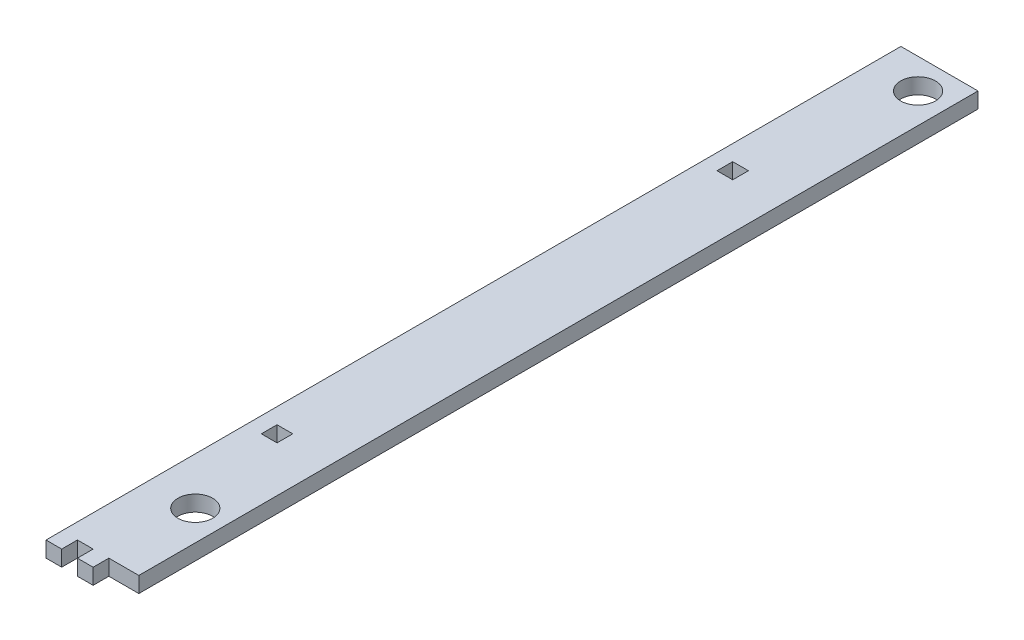
ISO-10303-21;
HEADER;
FILE_DESCRIPTION(('STEP AP214'),'2;1');
FILE_NAME('part.step','',(''),(''),'','','');
FILE_SCHEMA(('AUTOMOTIVE_DESIGN { 1 0 10303 214 1 1 1 1 }'));
ENDSEC;
DATA;
#1=APPLICATION_CONTEXT('core data for automotive mechanical design processes');
#2=APPLICATION_PROTOCOL_DEFINITION('international standard','automotive_design',2000,#1);
#3=PRODUCT_CONTEXT('',#1,'mechanical');
#4=PRODUCT('Part','Part','',(#3));
#5=PRODUCT_RELATED_PRODUCT_CATEGORY('part','',(#4));
#6=PRODUCT_DEFINITION_FORMATION('','',#4);
#7=PRODUCT_DEFINITION_CONTEXT('part definition',#1,'design');
#8=PRODUCT_DEFINITION('design','',#6,#7);
#9=PRODUCT_DEFINITION_SHAPE('','',#8);
#10=(LENGTH_UNIT() NAMED_UNIT(*) SI_UNIT(.MILLI.,.METRE.));
#11=(NAMED_UNIT(*) PLANE_ANGLE_UNIT() SI_UNIT($,.RADIAN.));
#12=(NAMED_UNIT(*) SI_UNIT($,.STERADIAN.) SOLID_ANGLE_UNIT());
#13=UNCERTAINTY_MEASURE_WITH_UNIT(LENGTH_MEASURE(1.E-05),#10,'distance_accuracy_value','');
#14=(GEOMETRIC_REPRESENTATION_CONTEXT(3) GLOBAL_UNCERTAINTY_ASSIGNED_CONTEXT((#13)) GLOBAL_UNIT_ASSIGNED_CONTEXT((#10,
#11,#12)) REPRESENTATION_CONTEXT('',''));
#15=CARTESIAN_POINT('',(0.,0.,0.));
#16=DIRECTION('',(0.,0.,1.));
#17=DIRECTION('',(1.,0.,0.));
#18=AXIS2_PLACEMENT_3D('',#15,#16,#17);
#19=CARTESIAN_POINT('',(0.,6.35,0.));
#20=DIRECTION('',(0.,1.,0.));
#21=DIRECTION('',(0.,0.,1.));
#22=AXIS2_PLACEMENT_3D('',#19,#20,#21);
#23=PLANE('',#22);
#24=DIRECTION('',(1.,0.,0.));
#25=VECTOR('',#24,1.);
#26=CARTESIAN_POINT('',(6.34999999999996,6.35,-88.9));
#27=LINE('',#26,#25);
#28=CARTESIAN_POINT('',(6.34999999999996,6.35,-88.9));
#29=VERTEX_POINT('',#28);
#30=CARTESIAN_POINT('',(12.7,6.35,-88.9));
#31=VERTEX_POINT('',#30);
#32=EDGE_CURVE('E196',#29,#31,#27,.T.);
#33=ORIENTED_EDGE('',*,*,#32,.F.);
#34=DIRECTION('',(0.,0.,1.));
#35=VECTOR('',#34,1.);
#36=CARTESIAN_POINT('',(6.34999999999996,6.35,-95.25));
#37=LINE('',#36,#35);
#38=CARTESIAN_POINT('',(6.34999999999996,6.35,-95.25));
#39=VERTEX_POINT('',#38);
#40=EDGE_CURVE('E194',#39,#29,#37,.T.);
#41=ORIENTED_EDGE('',*,*,#40,.F.);
#42=DIRECTION('',(-1.,0.,0.));
#43=VECTOR('',#42,1.);
#44=CARTESIAN_POINT('',(6.34999999999996,6.35,-95.25));
#45=LINE('',#44,#43);
#46=CARTESIAN_POINT('',(12.7,6.35,-95.25));
#47=VERTEX_POINT('',#46);
#48=EDGE_CURVE('E202',#47,#39,#45,.T.);
#49=ORIENTED_EDGE('',*,*,#48,.F.);
#50=DIRECTION('',(0.,0.,-1.));
#51=VECTOR('',#50,1.);
#52=CARTESIAN_POINT('',(12.7,6.35,-95.25));
#53=LINE('',#52,#51);
#54=EDGE_CURVE('E199',#31,#47,#53,.T.);
#55=ORIENTED_EDGE('',*,*,#54,.F.);
#56=EDGE_LOOP('',(#33,#41,#49,#55));
#57=FACE_BOUND('',#56,.T.);
#58=CARTESIAN_POINT('',(19.05,6.35,134.642564030267));
#59=DIRECTION('',(0.,1.,0.));
#60=DIRECTION('',(0.,0.,-1.));
#61=AXIS2_PLACEMENT_3D('',#58,#59,#60);
#62=CIRCLE('',#61,7.03012806053458);
#63=CARTESIAN_POINT('',(19.05,6.35,127.612435969733));
#64=VERTEX_POINT('',#63);
#65=EDGE_CURVE('E231',#64,#64,#62,.T.);
#66=ORIENTED_EDGE('',*,*,#65,.F.);
#67=EDGE_LOOP('',(#66));
#68=FACE_BOUND('',#67,.T.);
#69=DIRECTION('',(-1.,0.,0.));
#70=VECTOR('',#69,1.);
#71=CARTESIAN_POINT('',(0.,6.35,-169.567564030267));
#72=LINE('',#71,#70);
#73=CARTESIAN_POINT('',(31.1601280605345,6.35,-169.567564030267));
#74=VERTEX_POINT('',#73);
#75=CARTESIAN_POINT('',(0.,6.35,-169.567564030267));
#76=VERTEX_POINT('',#75);
#77=EDGE_CURVE('E237',#74,#76,#72,.T.);
#78=ORIENTED_EDGE('',*,*,#77,.T.);
#79=DIRECTION('',(0.,0.,1.));
#80=VECTOR('',#79,1.);
#81=CARTESIAN_POINT('',(0.,6.35,175.917564030267));
#82=LINE('',#81,#80);
#83=CARTESIAN_POINT('',(0.,6.35,175.917564030267));
#84=VERTEX_POINT('',#83);
#85=EDGE_CURVE('E240',#76,#84,#82,.T.);
#86=ORIENTED_EDGE('',*,*,#85,.T.);
#87=DIRECTION('',(1.,0.,0.));
#88=VECTOR('',#87,1.);
#89=CARTESIAN_POINT('',(0.,6.35,175.917564030267));
#90=LINE('',#89,#88);
#91=CARTESIAN_POINT('',(6.35,6.35,175.917564030267));
#92=VERTEX_POINT('',#91);
#93=EDGE_CURVE('E243',#84,#92,#90,.T.);
#94=ORIENTED_EDGE('',*,*,#93,.T.);
#95=DIRECTION('',(0.,0.,-1.));
#96=VECTOR('',#95,1.);
#97=CARTESIAN_POINT('',(6.35,6.35,175.917564030267));
#98=LINE('',#97,#96);
#99=CARTESIAN_POINT('',(6.35,6.35,169.567564030267));
#100=VERTEX_POINT('',#99);
#101=EDGE_CURVE('E245',#92,#100,#98,.T.);
#102=ORIENTED_EDGE('',*,*,#101,.T.);
#103=DIRECTION('',(1.,0.,0.));
#104=VECTOR('',#103,1.);
#105=CARTESIAN_POINT('',(6.35,6.35,169.567564030267));
#106=LINE('',#105,#104);
#107=CARTESIAN_POINT('',(12.7,6.35,169.567564030267));
#108=VERTEX_POINT('',#107);
#109=EDGE_CURVE('E247',#100,#108,#106,.T.);
#110=ORIENTED_EDGE('',*,*,#109,.T.);
#111=DIRECTION('',(0.,0.,1.));
#112=VECTOR('',#111,1.);
#113=CARTESIAN_POINT('',(12.7,6.35,169.567564030267));
#114=LINE('',#113,#112);
#115=CARTESIAN_POINT('',(12.7,6.35,175.917564030267));
#116=VERTEX_POINT('',#115);
#117=EDGE_CURVE('E249',#108,#116,#114,.T.);
#118=ORIENTED_EDGE('',*,*,#117,.T.);
#119=DIRECTION('',(1.,0.,0.));
#120=VECTOR('',#119,1.);
#121=CARTESIAN_POINT('',(12.7,6.35,175.917564030267));
#122=LINE('',#121,#120);
#123=CARTESIAN_POINT('',(19.05,6.35,175.917564030267));
#124=VERTEX_POINT('',#123);
#125=EDGE_CURVE('E251',#116,#124,#122,.T.);
#126=ORIENTED_EDGE('',*,*,#125,.T.);
#127=DIRECTION('',(0.,0.,-1.));
#128=VECTOR('',#127,1.);
#129=CARTESIAN_POINT('',(19.05,6.35,175.917564030267));
#130=LINE('',#129,#128);
#131=CARTESIAN_POINT('',(19.05,6.35,169.567564030267));
#132=VERTEX_POINT('',#131);
#133=EDGE_CURVE('E253',#124,#132,#130,.T.);
#134=ORIENTED_EDGE('',*,*,#133,.T.);
#135=DIRECTION('',(1.,0.,0.));
#136=VECTOR('',#135,1.);
#137=CARTESIAN_POINT('',(19.05,6.35,169.567564030267));
#138=LINE('',#137,#136);
#139=CARTESIAN_POINT('',(31.1601280605345,6.35,169.567564030267));
#140=VERTEX_POINT('',#139);
#141=EDGE_CURVE('E255',#132,#140,#138,.T.);
#142=ORIENTED_EDGE('',*,*,#141,.T.);
#143=DIRECTION('',(0.,0.,-1.));
#144=VECTOR('',#143,1.);
#145=CARTESIAN_POINT('',(31.1601280605345,6.35,169.567564030267));
#146=LINE('',#145,#144);
#147=EDGE_CURVE('E257',#140,#74,#146,.T.);
#148=ORIENTED_EDGE('',*,*,#147,.T.);
#149=EDGE_LOOP('',(#78,#86,#94,#102,#110,#118,#126,#134,#142,#148));
#150=FACE_BOUND('',#149,.T.);
#151=CARTESIAN_POINT('',(19.0499999999999,6.35,-157.457435969733));
#152=DIRECTION('',(0.,1.,0.));
#153=DIRECTION('',(0.,0.,1.));
#154=AXIS2_PLACEMENT_3D('',#151,#152,#153);
#155=CIRCLE('',#154,7.03012806053458);
#156=CARTESIAN_POINT('',(19.0499999999999,6.35,-150.427307909198));
#157=VERTEX_POINT('',#156);
#158=EDGE_CURVE('E225',#157,#157,#155,.T.);
#159=ORIENTED_EDGE('',*,*,#158,.F.);
#160=EDGE_LOOP('',(#159));
#161=FACE_BOUND('',#160,.T.);
#162=DIRECTION('',(0.,0.,-1.));
#163=VECTOR('',#162,1.);
#164=CARTESIAN_POINT('',(12.7,6.35,95.25));
#165=LINE('',#164,#163);
#166=CARTESIAN_POINT('',(12.7,6.35,95.25));
#167=VERTEX_POINT('',#166);
#168=CARTESIAN_POINT('',(12.7,6.35,88.9));
#169=VERTEX_POINT('',#168);
#170=EDGE_CURVE('E166',#167,#169,#165,.T.);
#171=ORIENTED_EDGE('',*,*,#170,.F.);
#172=DIRECTION('',(1.,0.,0.));
#173=VECTOR('',#172,1.);
#174=CARTESIAN_POINT('',(6.34999999999996,6.35,95.25));
#175=LINE('',#174,#173);
#176=CARTESIAN_POINT('',(6.34999999999996,6.35,95.25));
#177=VERTEX_POINT('',#176);
#178=EDGE_CURVE('E158',#177,#167,#175,.T.);
#179=ORIENTED_EDGE('',*,*,#178,.F.);
#180=DIRECTION('',(0.,0.,1.));
#181=VECTOR('',#180,1.);
#182=CARTESIAN_POINT('',(6.34999999999996,6.35,95.25));
#183=LINE('',#182,#181);
#184=CARTESIAN_POINT('',(6.34999999999996,6.35,88.9));
#185=VERTEX_POINT('',#184);
#186=EDGE_CURVE('E180',#185,#177,#183,.T.);
#187=ORIENTED_EDGE('',*,*,#186,.F.);
#188=DIRECTION('',(-1.,0.,0.));
#189=VECTOR('',#188,1.);
#190=CARTESIAN_POINT('',(6.34999999999996,6.35,88.9));
#191=LINE('',#190,#189);
#192=EDGE_CURVE('E178',#169,#185,#191,.T.);
#193=ORIENTED_EDGE('',*,*,#192,.F.);
#194=EDGE_LOOP('',(#171,#179,#187,#193));
#195=FACE_BOUND('',#194,.T.);
#196=ADVANCED_FACE('F33',(#57,#68,#150,#161,#195),#23,.T.);
#197=CARTESIAN_POINT('',(0.,0.,0.));
#198=DIRECTION('',(0.,1.,0.));
#199=DIRECTION('',(0.,0.,1.));
#200=AXIS2_PLACEMENT_3D('',#197,#198,#199);
#201=PLANE('',#200);
#202=DIRECTION('',(0.,0.,1.));
#203=VECTOR('',#202,1.);
#204=CARTESIAN_POINT('',(6.34999999999996,0.,-95.25));
#205=LINE('',#204,#203);
#206=CARTESIAN_POINT('',(6.34999999999996,0.,-95.25));
#207=VERTEX_POINT('',#206);
#208=CARTESIAN_POINT('',(6.34999999999996,0.,-88.9));
#209=VERTEX_POINT('',#208);
#210=EDGE_CURVE('E174',#207,#209,#205,.T.);
#211=ORIENTED_EDGE('',*,*,#210,.T.);
#212=DIRECTION('',(1.,0.,0.));
#213=VECTOR('',#212,1.);
#214=CARTESIAN_POINT('',(6.34999999999996,0.,-88.9));
#215=LINE('',#214,#213);
#216=CARTESIAN_POINT('',(12.7,0.,-88.9));
#217=VERTEX_POINT('',#216);
#218=EDGE_CURVE('E207',#209,#217,#215,.T.);
#219=ORIENTED_EDGE('',*,*,#218,.T.);
#220=DIRECTION('',(0.,0.,-1.));
#221=VECTOR('',#220,1.);
#222=CARTESIAN_POINT('',(12.7,0.,-95.25));
#223=LINE('',#222,#221);
#224=CARTESIAN_POINT('',(12.7,0.,-95.25));
#225=VERTEX_POINT('',#224);
#226=EDGE_CURVE('E210',#217,#225,#223,.T.);
#227=ORIENTED_EDGE('',*,*,#226,.T.);
#228=DIRECTION('',(-1.,0.,0.));
#229=VECTOR('',#228,1.);
#230=CARTESIAN_POINT('',(6.34999999999996,0.,-95.25));
#231=LINE('',#230,#229);
#232=EDGE_CURVE('E197',#225,#207,#231,.T.);
#233=ORIENTED_EDGE('',*,*,#232,.T.);
#234=EDGE_LOOP('',(#211,#219,#227,#233));
#235=FACE_BOUND('',#234,.T.);
#236=CARTESIAN_POINT('',(19.05,0.,134.642564030267));
#237=DIRECTION('',(0.,1.,0.));
#238=DIRECTION('',(0.,0.,-1.));
#239=AXIS2_PLACEMENT_3D('',#236,#237,#238);
#240=CIRCLE('',#239,7.03012806053458);
#241=CARTESIAN_POINT('',(19.05,0.,127.612435969733));
#242=VERTEX_POINT('',#241);
#243=EDGE_CURVE('E228',#242,#242,#240,.T.);
#244=ORIENTED_EDGE('',*,*,#243,.T.);
#245=EDGE_LOOP('',(#244));
#246=FACE_BOUND('',#245,.T.);
#247=DIRECTION('',(-1.,0.,0.));
#248=VECTOR('',#247,1.);
#249=CARTESIAN_POINT('',(0.,0.,-169.567564030267));
#250=LINE('',#249,#248);
#251=CARTESIAN_POINT('',(31.1601280605345,0.,-169.567564030267));
#252=VERTEX_POINT('',#251);
#253=CARTESIAN_POINT('',(0.,0.,-169.567564030267));
#254=VERTEX_POINT('',#253);
#255=EDGE_CURVE('E234',#252,#254,#250,.T.);
#256=ORIENTED_EDGE('',*,*,#255,.F.);
#257=DIRECTION('',(0.,0.,-1.));
#258=VECTOR('',#257,1.);
#259=CARTESIAN_POINT('',(31.1601280605345,0.,169.567564030267));
#260=LINE('',#259,#258);
#261=CARTESIAN_POINT('',(31.1601280605345,0.,169.567564030267));
#262=VERTEX_POINT('',#261);
#263=EDGE_CURVE('E241',#262,#252,#260,.T.);
#264=ORIENTED_EDGE('',*,*,#263,.F.);
#265=DIRECTION('',(1.,0.,0.));
#266=VECTOR('',#265,1.);
#267=CARTESIAN_POINT('',(19.05,0.,169.567564030267));
#268=LINE('',#267,#266);
#269=CARTESIAN_POINT('',(19.05,0.,169.567564030267));
#270=VERTEX_POINT('',#269);
#271=EDGE_CURVE('E276',#270,#262,#268,.T.);
#272=ORIENTED_EDGE('',*,*,#271,.F.);
#273=DIRECTION('',(0.,0.,-1.));
#274=VECTOR('',#273,1.);
#275=CARTESIAN_POINT('',(19.05,0.,175.917564030267));
#276=LINE('',#275,#274);
#277=CARTESIAN_POINT('',(19.05,0.,175.917564030267));
#278=VERTEX_POINT('',#277);
#279=EDGE_CURVE('E274',#278,#270,#276,.T.);
#280=ORIENTED_EDGE('',*,*,#279,.F.);
#281=DIRECTION('',(1.,0.,0.));
#282=VECTOR('',#281,1.);
#283=CARTESIAN_POINT('',(12.7,0.,175.917564030267));
#284=LINE('',#283,#282);
#285=CARTESIAN_POINT('',(12.7,0.,175.917564030267));
#286=VERTEX_POINT('',#285);
#287=EDGE_CURVE('E272',#286,#278,#284,.T.);
#288=ORIENTED_EDGE('',*,*,#287,.F.);
#289=DIRECTION('',(0.,0.,1.));
#290=VECTOR('',#289,1.);
#291=CARTESIAN_POINT('',(12.7,0.,169.567564030267));
#292=LINE('',#291,#290);
#293=CARTESIAN_POINT('',(12.7,0.,169.567564030267));
#294=VERTEX_POINT('',#293);
#295=EDGE_CURVE('E270',#294,#286,#292,.T.);
#296=ORIENTED_EDGE('',*,*,#295,.F.);
#297=DIRECTION('',(1.,0.,0.));
#298=VECTOR('',#297,1.);
#299=CARTESIAN_POINT('',(6.35,0.,169.567564030267));
#300=LINE('',#299,#298);
#301=CARTESIAN_POINT('',(6.35,0.,169.567564030267));
#302=VERTEX_POINT('',#301);
#303=EDGE_CURVE('E268',#302,#294,#300,.T.);
#304=ORIENTED_EDGE('',*,*,#303,.F.);
#305=DIRECTION('',(0.,0.,-1.));
#306=VECTOR('',#305,1.);
#307=CARTESIAN_POINT('',(6.35,0.,175.917564030267));
#308=LINE('',#307,#306);
#309=CARTESIAN_POINT('',(6.35,0.,175.917564030267));
#310=VERTEX_POINT('',#309);
#311=EDGE_CURVE('E266',#310,#302,#308,.T.);
#312=ORIENTED_EDGE('',*,*,#311,.F.);
#313=DIRECTION('',(1.,0.,0.));
#314=VECTOR('',#313,1.);
#315=CARTESIAN_POINT('',(0.,0.,175.917564030267));
#316=LINE('',#315,#314);
#317=CARTESIAN_POINT('',(0.,0.,175.917564030267));
#318=VERTEX_POINT('',#317);
#319=EDGE_CURVE('E264',#318,#310,#316,.T.);
#320=ORIENTED_EDGE('',*,*,#319,.F.);
#321=DIRECTION('',(0.,0.,1.));
#322=VECTOR('',#321,1.);
#323=CARTESIAN_POINT('',(0.,0.,175.917564030267));
#324=LINE('',#323,#322);
#325=EDGE_CURVE('E262',#254,#318,#324,.T.);
#326=ORIENTED_EDGE('',*,*,#325,.F.);
#327=EDGE_LOOP('',(#256,#264,#272,#280,#288,#296,#304,#312,#320,#326));
#328=FACE_BOUND('',#327,.T.);
#329=CARTESIAN_POINT('',(19.0499999999999,0.,-157.457435969733));
#330=DIRECTION('',(0.,1.,0.));
#331=DIRECTION('',(0.,0.,1.));
#332=AXIS2_PLACEMENT_3D('',#329,#330,#331);
#333=CIRCLE('',#332,7.03012806053458);
#334=CARTESIAN_POINT('',(19.0499999999999,0.,-150.427307909198));
#335=VERTEX_POINT('',#334);
#336=EDGE_CURVE('E224',#335,#335,#333,.T.);
#337=ORIENTED_EDGE('',*,*,#336,.T.);
#338=EDGE_LOOP('',(#337));
#339=FACE_BOUND('',#338,.T.);
#340=DIRECTION('',(1.,0.,0.));
#341=VECTOR('',#340,1.);
#342=CARTESIAN_POINT('',(6.34999999999996,0.,95.25));
#343=LINE('',#342,#341);
#344=CARTESIAN_POINT('',(6.34999999999996,0.,95.25));
#345=VERTEX_POINT('',#344);
#346=CARTESIAN_POINT('',(12.7,0.,95.25));
#347=VERTEX_POINT('',#346);
#348=EDGE_CURVE('E56',#345,#347,#343,.T.);
#349=ORIENTED_EDGE('',*,*,#348,.T.);
#350=DIRECTION('',(0.,0.,-1.));
#351=VECTOR('',#350,1.);
#352=CARTESIAN_POINT('',(12.7,0.,95.25));
#353=LINE('',#352,#351);
#354=CARTESIAN_POINT('',(12.7,0.,88.9));
#355=VERTEX_POINT('',#354);
#356=EDGE_CURVE('E173',#347,#355,#353,.T.);
#357=ORIENTED_EDGE('',*,*,#356,.T.);
#358=DIRECTION('',(-1.,0.,0.));
#359=VECTOR('',#358,1.);
#360=CARTESIAN_POINT('',(6.34999999999996,0.,88.9));
#361=LINE('',#360,#359);
#362=CARTESIAN_POINT('',(6.34999999999996,0.,88.9));
#363=VERTEX_POINT('',#362);
#364=EDGE_CURVE('E186',#355,#363,#361,.T.);
#365=ORIENTED_EDGE('',*,*,#364,.T.);
#366=DIRECTION('',(0.,0.,1.));
#367=VECTOR('',#366,1.);
#368=CARTESIAN_POINT('',(6.34999999999996,0.,95.25));
#369=LINE('',#368,#367);
#370=EDGE_CURVE('E167',#363,#345,#369,.T.);
#371=ORIENTED_EDGE('',*,*,#370,.T.);
#372=EDGE_LOOP('',(#349,#357,#365,#371));
#373=FACE_BOUND('',#372,.T.);
#374=ADVANCED_FACE('F312',(#235,#246,#328,#339,#373),#201,.F.);
#375=CARTESIAN_POINT('',(0.,6.35,-169.567564030267));
#376=DIRECTION('',(0.,0.,1.));
#377=DIRECTION('',(1.,0.,0.));
#378=AXIS2_PLACEMENT_3D('',#375,#376,#377);
#379=PLANE('',#378);
#380=ORIENTED_EDGE('',*,*,#255,.T.);
#381=DIRECTION('',(0.,-1.,0.));
#382=VECTOR('',#381,1.);
#383=CARTESIAN_POINT('',(0.,6.35,-169.567564030267));
#384=LINE('',#383,#382);
#385=EDGE_CURVE('E11',#76,#254,#384,.T.);
#386=ORIENTED_EDGE('',*,*,#385,.F.);
#387=ORIENTED_EDGE('',*,*,#77,.F.);
#388=DIRECTION('',(0.,-1.,0.));
#389=VECTOR('',#388,1.);
#390=CARTESIAN_POINT('',(31.1601280605345,6.35,-169.567564030267));
#391=LINE('',#390,#389);
#392=EDGE_CURVE('E259',#74,#252,#391,.T.);
#393=ORIENTED_EDGE('',*,*,#392,.T.);
#394=EDGE_LOOP('',(#380,#386,#387,#393));
#395=FACE_BOUND('',#394,.T.);
#396=ADVANCED_FACE('F35',(#395),#379,.F.);
#397=CARTESIAN_POINT('',(0.,6.35,175.917564030267));
#398=DIRECTION('',(1.,0.,0.));
#399=DIRECTION('',(0.,0.,-1.));
#400=AXIS2_PLACEMENT_3D('',#397,#398,#399);
#401=PLANE('',#400);
#402=ORIENTED_EDGE('',*,*,#325,.T.);
#403=DIRECTION('',(0.,-1.,0.));
#404=VECTOR('',#403,1.);
#405=CARTESIAN_POINT('',(0.,6.35,175.917564030267));
#406=LINE('',#405,#404);
#407=EDGE_CURVE('E41',#84,#318,#406,.T.);
#408=ORIENTED_EDGE('',*,*,#407,.F.);
#409=ORIENTED_EDGE('',*,*,#85,.F.);
#410=ORIENTED_EDGE('',*,*,#385,.T.);
#411=EDGE_LOOP('',(#402,#408,#409,#410));
#412=FACE_BOUND('',#411,.T.);
#413=ADVANCED_FACE('F330',(#412),#401,.F.);
#414=CARTESIAN_POINT('',(0.,6.35,175.917564030267));
#415=DIRECTION('',(0.,0.,-1.));
#416=DIRECTION('',(-1.,0.,0.));
#417=AXIS2_PLACEMENT_3D('',#414,#415,#416);
#418=PLANE('',#417);
#419=ORIENTED_EDGE('',*,*,#319,.T.);
#420=DIRECTION('',(0.,-1.,0.));
#421=VECTOR('',#420,1.);
#422=CARTESIAN_POINT('',(6.35,6.35,175.917564030267));
#423=LINE('',#422,#421);
#424=EDGE_CURVE('E299',#92,#310,#423,.T.);
#425=ORIENTED_EDGE('',*,*,#424,.F.);
#426=ORIENTED_EDGE('',*,*,#93,.F.);
#427=ORIENTED_EDGE('',*,*,#407,.T.);
#428=EDGE_LOOP('',(#419,#425,#426,#427));
#429=FACE_BOUND('',#428,.T.);
#430=ADVANCED_FACE('F306',(#429),#418,.F.);
#431=CARTESIAN_POINT('',(6.35,6.35,175.917564030267));
#432=DIRECTION('',(-1.,0.,0.));
#433=DIRECTION('',(0.,0.,1.));
#434=AXIS2_PLACEMENT_3D('',#431,#432,#433);
#435=PLANE('',#434);
#436=ORIENTED_EDGE('',*,*,#311,.T.);
#437=DIRECTION('',(0.,-1.,0.));
#438=VECTOR('',#437,1.);
#439=CARTESIAN_POINT('',(6.35,6.35,169.567564030267));
#440=LINE('',#439,#438);
#441=EDGE_CURVE('E296',#100,#302,#440,.T.);
#442=ORIENTED_EDGE('',*,*,#441,.F.);
#443=ORIENTED_EDGE('',*,*,#101,.F.);
#444=ORIENTED_EDGE('',*,*,#424,.T.);
#445=EDGE_LOOP('',(#436,#442,#443,#444));
#446=FACE_BOUND('',#445,.T.);
#447=ADVANCED_FACE('F318',(#446),#435,.F.);
#448=CARTESIAN_POINT('',(6.35,6.35,169.567564030267));
#449=DIRECTION('',(0.,0.,-1.));
#450=DIRECTION('',(-1.,0.,0.));
#451=AXIS2_PLACEMENT_3D('',#448,#449,#450);
#452=PLANE('',#451);
#453=ORIENTED_EDGE('',*,*,#303,.T.);
#454=DIRECTION('',(0.,-1.,0.));
#455=VECTOR('',#454,1.);
#456=CARTESIAN_POINT('',(12.7,6.35,169.567564030267));
#457=LINE('',#456,#455);
#458=EDGE_CURVE('E293',#108,#294,#457,.T.);
#459=ORIENTED_EDGE('',*,*,#458,.F.);
#460=ORIENTED_EDGE('',*,*,#109,.F.);
#461=ORIENTED_EDGE('',*,*,#441,.T.);
#462=EDGE_LOOP('',(#453,#459,#460,#461));
#463=FACE_BOUND('',#462,.T.);
#464=ADVANCED_FACE('F322',(#463),#452,.F.);
#465=CARTESIAN_POINT('',(12.7,6.35,169.567564030267));
#466=DIRECTION('',(1.,0.,0.));
#467=DIRECTION('',(0.,0.,-1.));
#468=AXIS2_PLACEMENT_3D('',#465,#466,#467);
#469=PLANE('',#468);
#470=ORIENTED_EDGE('',*,*,#295,.T.);
#471=DIRECTION('',(0.,-1.,0.));
#472=VECTOR('',#471,1.);
#473=CARTESIAN_POINT('',(12.7,6.35,175.917564030267));
#474=LINE('',#473,#472);
#475=EDGE_CURVE('E290',#116,#286,#474,.T.);
#476=ORIENTED_EDGE('',*,*,#475,.F.);
#477=ORIENTED_EDGE('',*,*,#117,.F.);
#478=ORIENTED_EDGE('',*,*,#458,.T.);
#479=EDGE_LOOP('',(#470,#476,#477,#478));
#480=FACE_BOUND('',#479,.T.);
#481=ADVANCED_FACE('F353',(#480),#469,.F.);
#482=CARTESIAN_POINT('',(12.7,6.35,175.917564030267));
#483=DIRECTION('',(0.,0.,-1.));
#484=DIRECTION('',(-1.,0.,0.));
#485=AXIS2_PLACEMENT_3D('',#482,#483,#484);
#486=PLANE('',#485);
#487=ORIENTED_EDGE('',*,*,#287,.T.);
#488=DIRECTION('',(0.,-1.,0.));
#489=VECTOR('',#488,1.);
#490=CARTESIAN_POINT('',(19.05,6.35,175.917564030267));
#491=LINE('',#490,#489);
#492=EDGE_CURVE('E287',#124,#278,#491,.T.);
#493=ORIENTED_EDGE('',*,*,#492,.F.);
#494=ORIENTED_EDGE('',*,*,#125,.F.);
#495=ORIENTED_EDGE('',*,*,#475,.T.);
#496=EDGE_LOOP('',(#487,#493,#494,#495));
#497=FACE_BOUND('',#496,.T.);
#498=ADVANCED_FACE('F350',(#497),#486,.F.);
#499=CARTESIAN_POINT('',(19.05,6.35,175.917564030267));
#500=DIRECTION('',(-1.,0.,0.));
#501=DIRECTION('',(0.,0.,1.));
#502=AXIS2_PLACEMENT_3D('',#499,#500,#501);
#503=PLANE('',#502);
#504=ORIENTED_EDGE('',*,*,#279,.T.);
#505=DIRECTION('',(0.,-1.,0.));
#506=VECTOR('',#505,1.);
#507=CARTESIAN_POINT('',(19.05,6.35,169.567564030267));
#508=LINE('',#507,#506);
#509=EDGE_CURVE('E284',#132,#270,#508,.T.);
#510=ORIENTED_EDGE('',*,*,#509,.F.);
#511=ORIENTED_EDGE('',*,*,#133,.F.);
#512=ORIENTED_EDGE('',*,*,#492,.T.);
#513=EDGE_LOOP('',(#504,#510,#511,#512));
#514=FACE_BOUND('',#513,.T.);
#515=ADVANCED_FACE('F346',(#514),#503,.F.);
#516=CARTESIAN_POINT('',(19.05,6.35,169.567564030267));
#517=DIRECTION('',(0.,0.,-1.));
#518=DIRECTION('',(-1.,0.,0.));
#519=AXIS2_PLACEMENT_3D('',#516,#517,#518);
#520=PLANE('',#519);
#521=ORIENTED_EDGE('',*,*,#271,.T.);
#522=DIRECTION('',(0.,-1.,0.));
#523=VECTOR('',#522,1.);
#524=CARTESIAN_POINT('',(31.1601280605345,6.35,169.567564030267));
#525=LINE('',#524,#523);
#526=EDGE_CURVE('E281',#140,#262,#525,.T.);
#527=ORIENTED_EDGE('',*,*,#526,.F.);
#528=ORIENTED_EDGE('',*,*,#141,.F.);
#529=ORIENTED_EDGE('',*,*,#509,.T.);
#530=EDGE_LOOP('',(#521,#527,#528,#529));
#531=FACE_BOUND('',#530,.T.);
#532=ADVANCED_FACE('F342',(#531),#520,.F.);
#533=CARTESIAN_POINT('',(31.1601280605345,6.35,169.567564030267));
#534=DIRECTION('',(-1.,0.,0.));
#535=DIRECTION('',(0.,0.,1.));
#536=AXIS2_PLACEMENT_3D('',#533,#534,#535);
#537=PLANE('',#536);
#538=ORIENTED_EDGE('',*,*,#263,.T.);
#539=ORIENTED_EDGE('',*,*,#392,.F.);
#540=ORIENTED_EDGE('',*,*,#147,.F.);
#541=ORIENTED_EDGE('',*,*,#526,.T.);
#542=EDGE_LOOP('',(#538,#539,#540,#541));
#543=FACE_BOUND('',#542,.T.);
#544=ADVANCED_FACE('F337',(#543),#537,.F.);
#545=CARTESIAN_POINT('',(19.05,6.35,134.642564030267));
#546=DIRECTION('',(0.,-1.,0.));
#547=DIRECTION('',(0.,0.,-1.));
#548=AXIS2_PLACEMENT_3D('',#545,#546,#547);
#549=CYLINDRICAL_SURFACE('',#548,7.03012806053458);
#550=ORIENTED_EDGE('',*,*,#65,.T.);
#551=EDGE_LOOP('',(#550));
#552=FACE_BOUND('',#551,.T.);
#553=ORIENTED_EDGE('',*,*,#243,.F.);
#554=EDGE_LOOP('',(#553));
#555=FACE_BOUND('',#554,.T.);
#556=ADVANCED_FACE('F373',(#552,#555),#549,.F.);
#557=CARTESIAN_POINT('',(19.0499999999999,6.35,-157.457435969733));
#558=DIRECTION('',(0.,-1.,0.));
#559=DIRECTION('',(0.,0.,-1.));
#560=AXIS2_PLACEMENT_3D('',#557,#558,#559);
#561=CYLINDRICAL_SURFACE('',#560,7.03012806053458);
#562=ORIENTED_EDGE('',*,*,#158,.T.);
#563=EDGE_LOOP('',(#562));
#564=FACE_BOUND('',#563,.T.);
#565=ORIENTED_EDGE('',*,*,#336,.F.);
#566=EDGE_LOOP('',(#565));
#567=FACE_BOUND('',#566,.T.);
#568=ADVANCED_FACE('F399',(#564,#567),#561,.F.);
#569=CARTESIAN_POINT('',(6.34999999999996,6.35,-95.25));
#570=DIRECTION('',(1.,0.,0.));
#571=DIRECTION('',(0.,0.,-1.));
#572=AXIS2_PLACEMENT_3D('',#569,#570,#571);
#573=PLANE('',#572);
#574=ORIENTED_EDGE('',*,*,#210,.F.);
#575=DIRECTION('',(0.,-1.,0.));
#576=VECTOR('',#575,1.);
#577=CARTESIAN_POINT('',(6.34999999999996,6.35,-95.25));
#578=LINE('',#577,#576);
#579=EDGE_CURVE('E204',#39,#207,#578,.T.);
#580=ORIENTED_EDGE('',*,*,#579,.F.);
#581=ORIENTED_EDGE('',*,*,#40,.T.);
#582=DIRECTION('',(0.,-1.,0.));
#583=VECTOR('',#582,1.);
#584=CARTESIAN_POINT('',(6.34999999999996,6.35,-88.9));
#585=LINE('',#584,#583);
#586=EDGE_CURVE('E221',#29,#209,#585,.T.);
#587=ORIENTED_EDGE('',*,*,#586,.T.);
#588=EDGE_LOOP('',(#574,#580,#581,#587));
#589=FACE_BOUND('',#588,.T.);
#590=ADVANCED_FACE('F406',(#589),#573,.T.);
#591=CARTESIAN_POINT('',(6.34999999999996,6.35,-88.9));
#592=DIRECTION('',(0.,0.,-1.));
#593=DIRECTION('',(-1.,0.,0.));
#594=AXIS2_PLACEMENT_3D('',#591,#592,#593);
#595=PLANE('',#594);
#596=ORIENTED_EDGE('',*,*,#218,.F.);
#597=ORIENTED_EDGE('',*,*,#586,.F.);
#598=ORIENTED_EDGE('',*,*,#32,.T.);
#599=DIRECTION('',(0.,-1.,0.));
#600=VECTOR('',#599,1.);
#601=CARTESIAN_POINT('',(12.7,6.35,-88.9));
#602=LINE('',#601,#600);
#603=EDGE_CURVE('E219',#31,#217,#602,.T.);
#604=ORIENTED_EDGE('',*,*,#603,.T.);
#605=EDGE_LOOP('',(#596,#597,#598,#604));
#606=FACE_BOUND('',#605,.T.);
#607=ADVANCED_FACE('F413',(#606),#595,.T.);
#608=CARTESIAN_POINT('',(12.7,6.35,-95.25));
#609=DIRECTION('',(-1.,0.,0.));
#610=DIRECTION('',(0.,0.,1.));
#611=AXIS2_PLACEMENT_3D('',#608,#609,#610);
#612=PLANE('',#611);
#613=ORIENTED_EDGE('',*,*,#226,.F.);
#614=ORIENTED_EDGE('',*,*,#603,.F.);
#615=ORIENTED_EDGE('',*,*,#54,.T.);
#616=DIRECTION('',(0.,-1.,0.));
#617=VECTOR('',#616,1.);
#618=CARTESIAN_POINT('',(12.7,6.35,-95.25));
#619=LINE('',#618,#617);
#620=EDGE_CURVE('E217',#47,#225,#619,.T.);
#621=ORIENTED_EDGE('',*,*,#620,.T.);
#622=EDGE_LOOP('',(#613,#614,#615,#621));
#623=FACE_BOUND('',#622,.T.);
#624=ADVANCED_FACE('F421',(#623),#612,.T.);
#625=CARTESIAN_POINT('',(6.34999999999996,6.35,-95.25));
#626=DIRECTION('',(0.,0.,1.));
#627=DIRECTION('',(1.,0.,0.));
#628=AXIS2_PLACEMENT_3D('',#625,#626,#627);
#629=PLANE('',#628);
#630=ORIENTED_EDGE('',*,*,#232,.F.);
#631=ORIENTED_EDGE('',*,*,#620,.F.);
#632=ORIENTED_EDGE('',*,*,#48,.T.);
#633=ORIENTED_EDGE('',*,*,#579,.T.);
#634=EDGE_LOOP('',(#630,#631,#632,#633));
#635=FACE_BOUND('',#634,.T.);
#636=ADVANCED_FACE('F429',(#635),#629,.T.);
#637=CARTESIAN_POINT('',(6.34999999999996,6.35,95.25));
#638=DIRECTION('',(0.,0.,-1.));
#639=DIRECTION('',(-1.,0.,0.));
#640=AXIS2_PLACEMENT_3D('',#637,#638,#639);
#641=PLANE('',#640);
#642=ORIENTED_EDGE('',*,*,#348,.F.);
#643=DIRECTION('',(0.,-1.,0.));
#644=VECTOR('',#643,1.);
#645=CARTESIAN_POINT('',(6.34999999999996,6.35,95.25));
#646=LINE('',#645,#644);
#647=EDGE_CURVE('E162',#177,#345,#646,.T.);
#648=ORIENTED_EDGE('',*,*,#647,.F.);
#649=ORIENTED_EDGE('',*,*,#178,.T.);
#650=DIRECTION('',(0.,-1.,0.));
#651=VECTOR('',#650,1.);
#652=CARTESIAN_POINT('',(12.7,6.35,95.25));
#653=LINE('',#652,#651);
#654=EDGE_CURVE('E161',#167,#347,#653,.T.);
#655=ORIENTED_EDGE('',*,*,#654,.T.);
#656=EDGE_LOOP('',(#642,#648,#649,#655));
#657=FACE_BOUND('',#656,.T.);
#658=ADVANCED_FACE('F160',(#657),#641,.T.);
#659=CARTESIAN_POINT('',(12.7,6.35,95.25));
#660=DIRECTION('',(-1.,0.,0.));
#661=DIRECTION('',(0.,0.,1.));
#662=AXIS2_PLACEMENT_3D('',#659,#660,#661);
#663=PLANE('',#662);
#664=ORIENTED_EDGE('',*,*,#356,.F.);
#665=ORIENTED_EDGE('',*,*,#654,.F.);
#666=ORIENTED_EDGE('',*,*,#170,.T.);
#667=DIRECTION('',(0.,-1.,0.));
#668=VECTOR('',#667,1.);
#669=CARTESIAN_POINT('',(12.7,6.35,88.9));
#670=LINE('',#669,#668);
#671=EDGE_CURVE('E175',#169,#355,#670,.T.);
#672=ORIENTED_EDGE('',*,*,#671,.T.);
#673=EDGE_LOOP('',(#664,#665,#666,#672));
#674=FACE_BOUND('',#673,.T.);
#675=ADVANCED_FACE('F170',(#674),#663,.T.);
#676=CARTESIAN_POINT('',(6.34999999999996,6.35,88.9));
#677=DIRECTION('',(0.,0.,1.));
#678=DIRECTION('',(1.,0.,0.));
#679=AXIS2_PLACEMENT_3D('',#676,#677,#678);
#680=PLANE('',#679);
#681=ORIENTED_EDGE('',*,*,#364,.F.);
#682=ORIENTED_EDGE('',*,*,#671,.F.);
#683=ORIENTED_EDGE('',*,*,#192,.T.);
#684=DIRECTION('',(0.,-1.,0.));
#685=VECTOR('',#684,1.);
#686=CARTESIAN_POINT('',(6.34999999999996,6.35,88.9));
#687=LINE('',#686,#685);
#688=EDGE_CURVE('E48',#185,#363,#687,.T.);
#689=ORIENTED_EDGE('',*,*,#688,.T.);
#690=EDGE_LOOP('',(#681,#682,#683,#689));
#691=FACE_BOUND('',#690,.T.);
#692=ADVANCED_FACE('F450',(#691),#680,.T.);
#693=CARTESIAN_POINT('',(6.34999999999996,6.35,95.25));
#694=DIRECTION('',(1.,0.,0.));
#695=DIRECTION('',(0.,0.,-1.));
#696=AXIS2_PLACEMENT_3D('',#693,#694,#695);
#697=PLANE('',#696);
#698=ORIENTED_EDGE('',*,*,#370,.F.);
#699=ORIENTED_EDGE('',*,*,#688,.F.);
#700=ORIENTED_EDGE('',*,*,#186,.T.);
#701=ORIENTED_EDGE('',*,*,#647,.T.);
#702=EDGE_LOOP('',(#698,#699,#700,#701));
#703=FACE_BOUND('',#702,.T.);
#704=ADVANCED_FACE('F457',(#703),#697,.T.);
#705=CLOSED_SHELL('',(#196,#374,#396,#413,#430,#447,#464,#481,#498,#515,#532,#544,#556,#568,
#590,#607,#624,#636,#658,#675,#692,#704));
#706=MANIFOLD_SOLID_BREP('B2',#705);
#707=ADVANCED_BREP_SHAPE_REPRESENTATION('',(#18,#706),#14);
#708=SHAPE_DEFINITION_REPRESENTATION(#9,#707);
ENDSEC;
END-ISO-10303-21;
